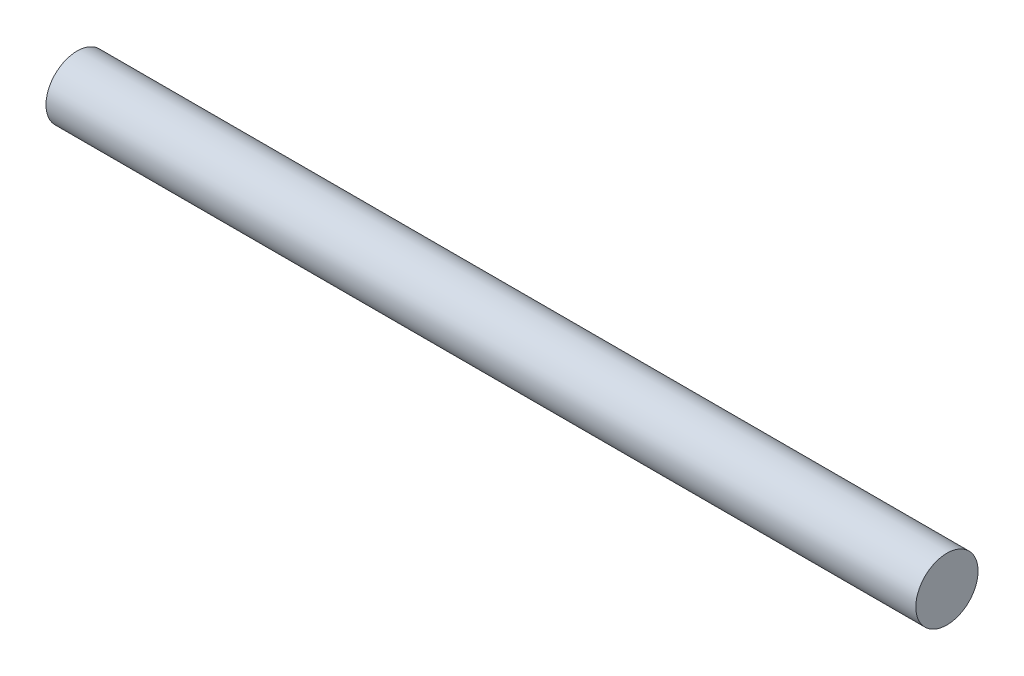
ISO-10303-21;
HEADER;
FILE_DESCRIPTION(('STEP AP214'),'2;1');
FILE_NAME('part.step','',(''),(''),'','','');
FILE_SCHEMA(('AUTOMOTIVE_DESIGN { 1 0 10303 214 1 1 1 1 }'));
ENDSEC;
DATA;
#1=APPLICATION_CONTEXT('core data for automotive mechanical design processes');
#2=APPLICATION_PROTOCOL_DEFINITION('international standard','automotive_design',2000,#1);
#3=PRODUCT_CONTEXT('',#1,'mechanical');
#4=PRODUCT('Part','Part','',(#3));
#5=PRODUCT_RELATED_PRODUCT_CATEGORY('part','',(#4));
#6=PRODUCT_DEFINITION_FORMATION('','',#4);
#7=PRODUCT_DEFINITION_CONTEXT('part definition',#1,'design');
#8=PRODUCT_DEFINITION('design','',#6,#7);
#9=PRODUCT_DEFINITION_SHAPE('','',#8);
#10=(LENGTH_UNIT() NAMED_UNIT(*) SI_UNIT(.MILLI.,.METRE.));
#11=(NAMED_UNIT(*) PLANE_ANGLE_UNIT() SI_UNIT($,.RADIAN.));
#12=(NAMED_UNIT(*) SI_UNIT($,.STERADIAN.) SOLID_ANGLE_UNIT());
#13=UNCERTAINTY_MEASURE_WITH_UNIT(LENGTH_MEASURE(1.E-05),#10,'distance_accuracy_value','');
#14=(GEOMETRIC_REPRESENTATION_CONTEXT(3) GLOBAL_UNCERTAINTY_ASSIGNED_CONTEXT((#13)) GLOBAL_UNIT_ASSIGNED_CONTEXT((#10,
#11,#12)) REPRESENTATION_CONTEXT('',''));
#15=CARTESIAN_POINT('',(0.,0.,0.));
#16=DIRECTION('',(0.,0.,1.));
#17=DIRECTION('',(1.,0.,0.));
#18=AXIS2_PLACEMENT_3D('',#15,#16,#17);
#19=CARTESIAN_POINT('',(0.,0.,0.));
#20=DIRECTION('',(1.,0.,0.));
#21=DIRECTION('',(0.,0.,-1.));
#22=AXIS2_PLACEMENT_3D('',#19,#20,#21);
#23=CYLINDRICAL_SURFACE('',#22,0.5);
#24=CARTESIAN_POINT('',(25.9741120659435,0.,0.));
#25=DIRECTION('',(-1.,0.,0.));
#26=DIRECTION('',(0.,0.,1.));
#27=AXIS2_PLACEMENT_3D('',#24,#25,#26);
#28=CIRCLE('',#27,0.5);
#29=CARTESIAN_POINT('',(25.9741120659435,0.,0.5));
#30=VERTEX_POINT('',#29);
#31=EDGE_CURVE('E10',#30,#30,#28,.F.);
#32=ORIENTED_EDGE('',*,*,#31,.F.);
#33=EDGE_LOOP('',(#32));
#34=FACE_BOUND('',#33,.T.);
#35=CARTESIAN_POINT('',(12.,0.,0.));
#36=DIRECTION('',(-1.,0.,0.));
#37=DIRECTION('',(0.,0.,1.));
#38=AXIS2_PLACEMENT_3D('',#35,#36,#37);
#39=CIRCLE('',#38,0.5);
#40=CARTESIAN_POINT('',(12.,0.,0.5));
#41=VERTEX_POINT('',#40);
#42=EDGE_CURVE('E43',#41,#41,#39,.T.);
#43=ORIENTED_EDGE('',*,*,#42,.F.);
#44=EDGE_LOOP('',(#43));
#45=FACE_BOUND('',#44,.T.);
#46=ADVANCED_FACE('F36',(#34,#45),#23,.T.);
#47=CARTESIAN_POINT('',(25.9741120659435,2.78187901260183,-10.));
#48=DIRECTION('',(-1.,0.,0.));
#49=DIRECTION('',(0.,0.,1.));
#50=AXIS2_PLACEMENT_3D('',#47,#48,#49);
#51=PLANE('',#50);
#52=ORIENTED_EDGE('',*,*,#31,.T.);
#53=EDGE_LOOP('',(#52));
#54=FACE_BOUND('',#53,.T.);
#55=ADVANCED_FACE('F53',(#54),#51,.F.);
#56=CARTESIAN_POINT('',(12.,0.,0.));
#57=DIRECTION('',(-1.,0.,0.));
#58=DIRECTION('',(0.,0.,1.));
#59=AXIS2_PLACEMENT_3D('',#56,#57,#58);
#60=PLANE('',#59);
#61=ORIENTED_EDGE('',*,*,#42,.T.);
#62=EDGE_LOOP('',(#61));
#63=FACE_BOUND('',#62,.T.);
#64=ADVANCED_FACE('F50',(#63),#60,.T.);
#65=CLOSED_SHELL('',(#46,#55,#64));
#66=MANIFOLD_SOLID_BREP('B2',#65);
#67=ADVANCED_BREP_SHAPE_REPRESENTATION('',(#18,#66),#14);
#68=SHAPE_DEFINITION_REPRESENTATION(#9,#67);
ENDSEC;
END-ISO-10303-21;
